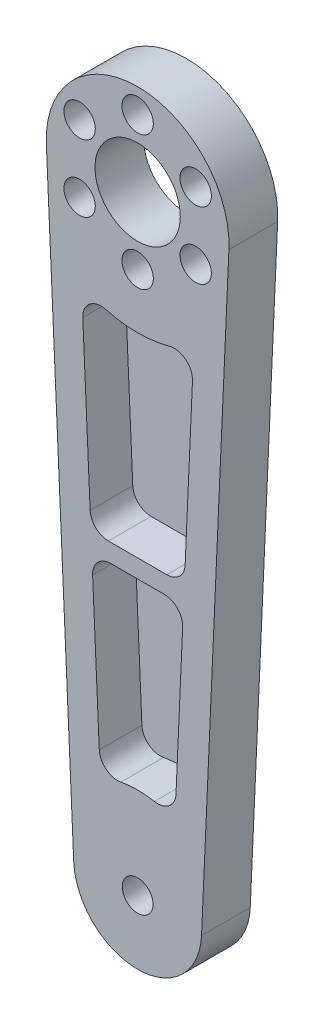
ISO-10303-21;
HEADER;
FILE_DESCRIPTION(('STEP AP214'),'2;1');
FILE_NAME('part.step','',(''),(''),'','','');
FILE_SCHEMA(('AUTOMOTIVE_DESIGN { 1 0 10303 214 1 1 1 1 }'));
ENDSEC;
DATA;
#1=APPLICATION_CONTEXT('core data for automotive mechanical design processes');
#2=APPLICATION_PROTOCOL_DEFINITION('international standard','automotive_design',2000,#1);
#3=PRODUCT_CONTEXT('',#1,'mechanical');
#4=PRODUCT('Part','Part','',(#3));
#5=PRODUCT_RELATED_PRODUCT_CATEGORY('part','',(#4));
#6=PRODUCT_DEFINITION_FORMATION('','',#4);
#7=PRODUCT_DEFINITION_CONTEXT('part definition',#1,'design');
#8=PRODUCT_DEFINITION('design','',#6,#7);
#9=PRODUCT_DEFINITION_SHAPE('','',#8);
#10=(LENGTH_UNIT() NAMED_UNIT(*) SI_UNIT(.MILLI.,.METRE.));
#11=(NAMED_UNIT(*) PLANE_ANGLE_UNIT() SI_UNIT($,.RADIAN.));
#12=(NAMED_UNIT(*) SI_UNIT($,.STERADIAN.) SOLID_ANGLE_UNIT());
#13=UNCERTAINTY_MEASURE_WITH_UNIT(LENGTH_MEASURE(1.E-05),#10,'distance_accuracy_value','');
#14=(GEOMETRIC_REPRESENTATION_CONTEXT(3) GLOBAL_UNCERTAINTY_ASSIGNED_CONTEXT((#13)) GLOBAL_UNIT_ASSIGNED_CONTEXT((#10,
#11,#12)) REPRESENTATION_CONTEXT('',''));
#15=CARTESIAN_POINT('',(0.,0.,0.));
#16=DIRECTION('',(0.,0.,1.));
#17=DIRECTION('',(1.,0.,0.));
#18=AXIS2_PLACEMENT_3D('',#15,#16,#17);
#19=CARTESIAN_POINT('',(0.,0.,8.));
#20=DIRECTION('',(0.,0.,1.));
#21=DIRECTION('',(1.,0.,0.));
#22=AXIS2_PLACEMENT_3D('',#19,#20,#21);
#23=PLANE('',#22);
#24=CARTESIAN_POINT('',(4.7998623234011,-49.,8.));
#25=DIRECTION('',(0.,0.,1.));
#26=DIRECTION('',(1.,0.,0.));
#27=AXIS2_PLACEMENT_3D('',#24,#25,#26);
#28=CIRCLE('',#27,3.);
#29=CARTESIAN_POINT('',(4.7998623234011,-52.,8.));
#30=VERTEX_POINT('',#29);
#31=CARTESIAN_POINT('',(7.79682328410779,-49.135,8.));
#32=VERTEX_POINT('',#31);
#33=EDGE_CURVE('E60',#30,#32,#28,.T.);
#34=ORIENTED_EDGE('',*,*,#33,.F.);
#35=DIRECTION('',(-1.,0.,0.));
#36=VECTOR('',#35,1.);
#37=CARTESIAN_POINT('',(0.,-52.,8.));
#38=LINE('',#37,#36);
#39=CARTESIAN_POINT('',(-4.79986232340109,-52.,8.));
#40=VERTEX_POINT('',#39);
#41=EDGE_CURVE('E203',#30,#40,#38,.T.);
#42=ORIENTED_EDGE('',*,*,#41,.T.);
#43=CARTESIAN_POINT('',(-4.79986232340108,-49.,8.));
#44=DIRECTION('',(0.,0.,1.));
#45=DIRECTION('',(1.,0.,0.));
#46=AXIS2_PLACEMENT_3D('',#43,#44,#45);
#47=CIRCLE('',#46,3.);
#48=CARTESIAN_POINT('',(-7.79682328410778,-49.135,8.));
#49=VERTEX_POINT('',#48);
#50=EDGE_CURVE('E206',#49,#40,#47,.T.);
#51=ORIENTED_EDGE('',*,*,#50,.F.);
#52=DIRECTION('',(-0.0449999999999999,0.998986986902232,0.));
#53=VECTOR('',#52,1.);
#54=CARTESIAN_POINT('',(-9.98986986902231,-0.449999999999999,8.));
#55=LINE('',#54,#53);
#56=CARTESIAN_POINT('',(-9.00396926551301,-22.3367082952188,8.));
#57=VERTEX_POINT('',#56);
#58=EDGE_CURVE('E232',#49,#57,#55,.T.);
#59=ORIENTED_EDGE('',*,*,#58,.T.);
#60=CARTESIAN_POINT('',(-6.00700830480632,-22.2017082952188,8.));
#61=DIRECTION('',(0.,0.,1.));
#62=DIRECTION('',(1.,0.,0.));
#63=AXIS2_PLACEMENT_3D('',#60,#61,#62);
#64=CIRCLE('',#63,3.);
#65=CARTESIAN_POINT('',(-5.22348548244029,-19.3058333001903,8.));
#66=VERTEX_POINT('',#65);
#67=EDGE_CURVE('E229',#66,#57,#64,.T.);
#68=ORIENTED_EDGE('',*,*,#67,.F.);
#69=CARTESIAN_POINT('',(0.,0.,8.));
#70=DIRECTION('',(0.,0.,1.));
#71=DIRECTION('',(1.,0.,0.));
#72=AXIS2_PLACEMENT_3D('',#69,#70,#71);
#73=CIRCLE('',#72,20.);
#74=CARTESIAN_POINT('',(5.22348548244028,-19.3058333001903,8.));
#75=VERTEX_POINT('',#74);
#76=EDGE_CURVE('E226',#66,#75,#73,.T.);
#77=ORIENTED_EDGE('',*,*,#76,.T.);
#78=CARTESIAN_POINT('',(6.00700830480632,-22.2017082952188,8.));
#79=DIRECTION('',(0.,0.,1.));
#80=DIRECTION('',(1.,0.,0.));
#81=AXIS2_PLACEMENT_3D('',#78,#79,#80);
#82=CIRCLE('',#81,3.);
#83=CARTESIAN_POINT('',(9.00396926551302,-22.3367082952188,8.));
#84=VERTEX_POINT('',#83);
#85=EDGE_CURVE('E223',#84,#75,#82,.T.);
#86=ORIENTED_EDGE('',*,*,#85,.F.);
#87=DIRECTION('',(-0.0449999999999997,-0.998986986902232,0.));
#88=VECTOR('',#87,1.);
#89=CARTESIAN_POINT('',(9.98986986902231,-0.449999999999997,8.));
#90=LINE('',#89,#88);
#91=EDGE_CURVE('E221',#84,#32,#90,.T.);
#92=ORIENTED_EDGE('',*,*,#91,.T.);
#93=EDGE_LOOP('',(#34,#42,#51,#59,#68,#77,#86,#92));
#94=FACE_BOUND('',#93,.T.);
#95=CARTESIAN_POINT('',(-4.39445163706585,-58.,8.));
#96=DIRECTION('',(0.,0.,1.));
#97=DIRECTION('',(1.,0.,0.));
#98=AXIS2_PLACEMENT_3D('',#95,#96,#97);
#99=CIRCLE('',#98,3.);
#100=CARTESIAN_POINT('',(-4.39445163706585,-55.,8.));
#101=VERTEX_POINT('',#100);
#102=CARTESIAN_POINT('',(-7.39141259777255,-58.135,8.));
#103=VERTEX_POINT('',#102);
#104=EDGE_CURVE('E68',#101,#103,#99,.T.);
#105=ORIENTED_EDGE('',*,*,#104,.F.);
#106=DIRECTION('',(1.,0.,0.));
#107=VECTOR('',#106,1.);
#108=CARTESIAN_POINT('',(0.,-55.,8.));
#109=LINE('',#108,#107);
#110=CARTESIAN_POINT('',(4.39445163706587,-55.,8.));
#111=VERTEX_POINT('',#110);
#112=EDGE_CURVE('E268',#101,#111,#109,.T.);
#113=ORIENTED_EDGE('',*,*,#112,.T.);
#114=CARTESIAN_POINT('',(4.39445163706587,-58.,8.));
#115=DIRECTION('',(0.,0.,1.));
#116=DIRECTION('',(1.,0.,0.));
#117=AXIS2_PLACEMENT_3D('',#114,#115,#116);
#118=CIRCLE('',#117,3.);
#119=CARTESIAN_POINT('',(7.39141259777256,-58.135,8.));
#120=VERTEX_POINT('',#119);
#121=EDGE_CURVE('E271',#120,#111,#118,.T.);
#122=ORIENTED_EDGE('',*,*,#121,.F.);
#123=DIRECTION('',(-0.0449999999999997,-0.998986986902232,0.));
#124=VECTOR('',#123,1.);
#125=CARTESIAN_POINT('',(9.98986986902231,-0.449999999999997,8.));
#126=LINE('',#125,#124);
#127=CARTESIAN_POINT('',(6.2965778841112,-82.4400140390341,8.));
#128=VERTEX_POINT('',#127);
#129=EDGE_CURVE('E275',#120,#128,#126,.T.);
#130=ORIENTED_EDGE('',*,*,#129,.T.);
#131=CARTESIAN_POINT('',(3.29961692340451,-82.305014039034,8.));
#132=DIRECTION('',(0.,0.,1.));
#133=DIRECTION('',(1.,0.,0.));
#134=AXIS2_PLACEMENT_3D('',#131,#132,#133);
#135=CIRCLE('',#134,3.);
#136=CARTESIAN_POINT('',(2.74968076950375,-85.2541783658617,8.));
#137=VERTEX_POINT('',#136);
#138=EDGE_CURVE('E278',#137,#128,#135,.T.);
#139=ORIENTED_EDGE('',*,*,#138,.F.);
#140=CARTESIAN_POINT('',(0.,-100.,8.));
#141=DIRECTION('',(0.,0.,1.));
#142=DIRECTION('',(1.,0.,0.));
#143=AXIS2_PLACEMENT_3D('',#140,#141,#142);
#144=CIRCLE('',#143,15.);
#145=CARTESIAN_POINT('',(-2.74968076950374,-85.2541783658617,8.));
#146=VERTEX_POINT('',#145);
#147=EDGE_CURVE('E281',#137,#146,#144,.T.);
#148=ORIENTED_EDGE('',*,*,#147,.T.);
#149=CARTESIAN_POINT('',(-3.29961692340449,-82.305014039034,8.));
#150=DIRECTION('',(0.,0.,1.));
#151=DIRECTION('',(1.,0.,0.));
#152=AXIS2_PLACEMENT_3D('',#149,#150,#151);
#153=CIRCLE('',#152,3.);
#154=CARTESIAN_POINT('',(-6.29657788411119,-82.440014039034,8.));
#155=VERTEX_POINT('',#154);
#156=EDGE_CURVE('E284',#155,#146,#153,.T.);
#157=ORIENTED_EDGE('',*,*,#156,.F.);
#158=DIRECTION('',(-0.045,0.998986986902232,0.));
#159=VECTOR('',#158,1.);
#160=CARTESIAN_POINT('',(-9.98986986902232,-0.45,8.));
#161=LINE('',#160,#159);
#162=EDGE_CURVE('E287',#155,#103,#161,.T.);
#163=ORIENTED_EDGE('',*,*,#162,.T.);
#164=EDGE_LOOP('',(#105,#113,#122,#130,#139,#148,#157,#163));
#165=FACE_BOUND('',#164,.T.);
#166=CARTESIAN_POINT('',(0.,0.,8.));
#167=DIRECTION('',(0.,0.,1.));
#168=DIRECTION('',(1.,0.,0.));
#169=AXIS2_PLACEMENT_3D('',#166,#167,#168);
#170=CIRCLE('',#169,7.);
#171=CARTESIAN_POINT('',(7.,0.,8.));
#172=VERTEX_POINT('',#171);
#173=EDGE_CURVE('E315',#172,#172,#170,.T.);
#174=ORIENTED_EDGE('',*,*,#173,.F.);
#175=EDGE_LOOP('',(#174));
#176=FACE_BOUND('',#175,.T.);
#177=CARTESIAN_POINT('',(-9.52627944162882,-5.5,8.));
#178=DIRECTION('',(0.,0.,1.));
#179=DIRECTION('',(1.,0.,0.));
#180=AXIS2_PLACEMENT_3D('',#177,#178,#179);
#181=CIRCLE('',#180,2.575);
#182=CARTESIAN_POINT('',(-6.95127944162882,-5.5,8.));
#183=VERTEX_POINT('',#182);
#184=EDGE_CURVE('E327',#183,#183,#181,.T.);
#185=ORIENTED_EDGE('',*,*,#184,.F.);
#186=EDGE_LOOP('',(#185));
#187=FACE_BOUND('',#186,.T.);
#188=CARTESIAN_POINT('',(9.52627944162882,-5.5,8.));
#189=DIRECTION('',(0.,0.,1.));
#190=DIRECTION('',(1.,0.,0.));
#191=AXIS2_PLACEMENT_3D('',#188,#189,#190);
#192=CIRCLE('',#191,2.575);
#193=CARTESIAN_POINT('',(12.1012794416288,-5.5,8.));
#194=VERTEX_POINT('',#193);
#195=EDGE_CURVE('E339',#194,#194,#192,.T.);
#196=ORIENTED_EDGE('',*,*,#195,.F.);
#197=EDGE_LOOP('',(#196));
#198=FACE_BOUND('',#197,.T.);
#199=CARTESIAN_POINT('',(0.,11.,8.));
#200=DIRECTION('',(0.,0.,1.));
#201=DIRECTION('',(1.,0.,0.));
#202=AXIS2_PLACEMENT_3D('',#199,#200,#201);
#203=CIRCLE('',#202,2.575);
#204=CARTESIAN_POINT('',(2.575,11.,8.));
#205=VERTEX_POINT('',#204);
#206=EDGE_CURVE('E351',#205,#205,#203,.T.);
#207=ORIENTED_EDGE('',*,*,#206,.F.);
#208=EDGE_LOOP('',(#207));
#209=FACE_BOUND('',#208,.T.);
#210=CARTESIAN_POINT('',(0.,0.,8.));
#211=DIRECTION('',(0.,0.,1.));
#212=DIRECTION('',(1.,0.,0.));
#213=AXIS2_PLACEMENT_3D('',#210,#211,#212);
#214=CIRCLE('',#213,15.);
#215=CARTESIAN_POINT('',(14.9848048035335,-0.674999999999999,8.));
#216=VERTEX_POINT('',#215);
#217=CARTESIAN_POINT('',(-14.9848048035335,-0.674999999999999,8.));
#218=VERTEX_POINT('',#217);
#219=EDGE_CURVE('E357',#216,#218,#214,.T.);
#220=ORIENTED_EDGE('',*,*,#219,.T.);
#221=DIRECTION('',(0.045,-0.998986986902232,0.));
#222=VECTOR('',#221,1.);
#223=CARTESIAN_POINT('',(-14.9848048035335,-0.674999999999999,8.));
#224=LINE('',#223,#222);
#225=CARTESIAN_POINT('',(-10.4893633624734,-100.4725,8.));
#226=VERTEX_POINT('',#225);
#227=EDGE_CURVE('E360',#218,#226,#224,.T.);
#228=ORIENTED_EDGE('',*,*,#227,.T.);
#229=CARTESIAN_POINT('',(0.,-100.,8.));
#230=DIRECTION('',(0.,0.,1.));
#231=DIRECTION('',(1.,0.,0.));
#232=AXIS2_PLACEMENT_3D('',#229,#230,#231);
#233=CIRCLE('',#232,10.5);
#234=CARTESIAN_POINT('',(10.4893633624734,-100.4725,8.));
#235=VERTEX_POINT('',#234);
#236=EDGE_CURVE('E363',#226,#235,#233,.T.);
#237=ORIENTED_EDGE('',*,*,#236,.T.);
#238=DIRECTION('',(0.045,0.998986986902232,0.));
#239=VECTOR('',#238,1.);
#240=CARTESIAN_POINT('',(14.9848048035335,-0.674999999999999,8.));
#241=LINE('',#240,#239);
#242=EDGE_CURVE('E365',#235,#216,#241,.T.);
#243=ORIENTED_EDGE('',*,*,#242,.T.);
#244=EDGE_LOOP('',(#220,#228,#237,#243));
#245=FACE_BOUND('',#244,.T.);
#246=CARTESIAN_POINT('',(9.52627944162882,5.50000000000001,8.));
#247=DIRECTION('',(0.,0.,1.));
#248=DIRECTION('',(1.,0.,0.));
#249=AXIS2_PLACEMENT_3D('',#246,#247,#248);
#250=CIRCLE('',#249,2.575);
#251=CARTESIAN_POINT('',(12.1012794416288,5.50000000000001,8.));
#252=VERTEX_POINT('',#251);
#253=EDGE_CURVE('E345',#252,#252,#250,.T.);
#254=ORIENTED_EDGE('',*,*,#253,.F.);
#255=EDGE_LOOP('',(#254));
#256=FACE_BOUND('',#255,.T.);
#257=CARTESIAN_POINT('',(0.,-11.,8.));
#258=DIRECTION('',(0.,0.,1.));
#259=DIRECTION('',(1.,0.,0.));
#260=AXIS2_PLACEMENT_3D('',#257,#258,#259);
#261=CIRCLE('',#260,2.575);
#262=CARTESIAN_POINT('',(2.575,-11.,8.));
#263=VERTEX_POINT('',#262);
#264=EDGE_CURVE('E333',#263,#263,#261,.T.);
#265=ORIENTED_EDGE('',*,*,#264,.F.);
#266=EDGE_LOOP('',(#265));
#267=FACE_BOUND('',#266,.T.);
#268=CARTESIAN_POINT('',(-9.52627944162883,5.49999999999999,8.));
#269=DIRECTION('',(0.,0.,1.));
#270=DIRECTION('',(1.,0.,0.));
#271=AXIS2_PLACEMENT_3D('',#268,#269,#270);
#272=CIRCLE('',#271,2.575);
#273=CARTESIAN_POINT('',(-6.95127944162883,5.49999999999999,8.));
#274=VERTEX_POINT('',#273);
#275=EDGE_CURVE('E321',#274,#274,#272,.T.);
#276=ORIENTED_EDGE('',*,*,#275,.F.);
#277=EDGE_LOOP('',(#276));
#278=FACE_BOUND('',#277,.T.);
#279=CARTESIAN_POINT('',(0.,-100.,8.));
#280=DIRECTION('',(0.,0.,1.));
#281=DIRECTION('',(1.,0.,0.));
#282=AXIS2_PLACEMENT_3D('',#279,#280,#281);
#283=CIRCLE('',#282,2.525);
#284=CARTESIAN_POINT('',(2.525,-100.,8.));
#285=VERTEX_POINT('',#284);
#286=EDGE_CURVE('E309',#285,#285,#283,.T.);
#287=ORIENTED_EDGE('',*,*,#286,.F.);
#288=EDGE_LOOP('',(#287));
#289=FACE_BOUND('',#288,.T.);
#290=ADVANCED_FACE('F45',(#94,#165,#176,#187,#198,#209,#245,#256,#267,#278,#289),#23,.T.);
#291=CARTESIAN_POINT('',(0.,0.,0.));
#292=DIRECTION('',(0.,0.,1.));
#293=DIRECTION('',(1.,0.,0.));
#294=AXIS2_PLACEMENT_3D('',#291,#292,#293);
#295=PLANE('',#294);
#296=CARTESIAN_POINT('',(0.,0.,0.));
#297=DIRECTION('',(0.,0.,1.));
#298=DIRECTION('',(1.,0.,0.));
#299=AXIS2_PLACEMENT_3D('',#296,#297,#298);
#300=CIRCLE('',#299,15.);
#301=CARTESIAN_POINT('',(14.9848048035335,-0.674999999999999,0.));
#302=VERTEX_POINT('',#301);
#303=CARTESIAN_POINT('',(-14.9848048035335,-0.674999999999999,0.));
#304=VERTEX_POINT('',#303);
#305=EDGE_CURVE('E354',#302,#304,#300,.T.);
#306=ORIENTED_EDGE('',*,*,#305,.F.);
#307=DIRECTION('',(0.045,0.998986986902232,0.));
#308=VECTOR('',#307,1.);
#309=CARTESIAN_POINT('',(14.9848048035335,-0.674999999999999,0.));
#310=LINE('',#309,#308);
#311=CARTESIAN_POINT('',(10.4893633624734,-100.4725,0.));
#312=VERTEX_POINT('',#311);
#313=EDGE_CURVE('E361',#312,#302,#310,.T.);
#314=ORIENTED_EDGE('',*,*,#313,.F.);
#315=CARTESIAN_POINT('',(0.,-100.,0.));
#316=DIRECTION('',(0.,0.,1.));
#317=DIRECTION('',(1.,0.,0.));
#318=AXIS2_PLACEMENT_3D('',#315,#316,#317);
#319=CIRCLE('',#318,10.5);
#320=CARTESIAN_POINT('',(-10.4893633624734,-100.4725,0.));
#321=VERTEX_POINT('',#320);
#322=EDGE_CURVE('E372',#321,#312,#319,.T.);
#323=ORIENTED_EDGE('',*,*,#322,.F.);
#324=DIRECTION('',(0.045,-0.998986986902232,0.));
#325=VECTOR('',#324,1.);
#326=CARTESIAN_POINT('',(-14.9848048035335,-0.674999999999999,0.));
#327=LINE('',#326,#325);
#328=EDGE_CURVE('E370',#304,#321,#327,.T.);
#329=ORIENTED_EDGE('',*,*,#328,.F.);
#330=EDGE_LOOP('',(#306,#314,#323,#329));
#331=FACE_BOUND('',#330,.T.);
#332=CARTESIAN_POINT('',(0.,11.,0.));
#333=DIRECTION('',(0.,0.,1.));
#334=DIRECTION('',(1.,0.,0.));
#335=AXIS2_PLACEMENT_3D('',#332,#333,#334);
#336=CIRCLE('',#335,2.575);
#337=CARTESIAN_POINT('',(2.575,11.,0.));
#338=VERTEX_POINT('',#337);
#339=EDGE_CURVE('E348',#338,#338,#336,.T.);
#340=ORIENTED_EDGE('',*,*,#339,.T.);
#341=EDGE_LOOP('',(#340));
#342=FACE_BOUND('',#341,.T.);
#343=CARTESIAN_POINT('',(9.52627944162882,5.50000000000001,0.));
#344=DIRECTION('',(0.,0.,1.));
#345=DIRECTION('',(1.,0.,0.));
#346=AXIS2_PLACEMENT_3D('',#343,#344,#345);
#347=CIRCLE('',#346,2.575);
#348=CARTESIAN_POINT('',(12.1012794416288,5.50000000000001,0.));
#349=VERTEX_POINT('',#348);
#350=EDGE_CURVE('E342',#349,#349,#347,.T.);
#351=ORIENTED_EDGE('',*,*,#350,.T.);
#352=EDGE_LOOP('',(#351));
#353=FACE_BOUND('',#352,.T.);
#354=CARTESIAN_POINT('',(9.52627944162882,-5.5,0.));
#355=DIRECTION('',(0.,0.,1.));
#356=DIRECTION('',(1.,0.,0.));
#357=AXIS2_PLACEMENT_3D('',#354,#355,#356);
#358=CIRCLE('',#357,2.575);
#359=CARTESIAN_POINT('',(12.1012794416288,-5.5,0.));
#360=VERTEX_POINT('',#359);
#361=EDGE_CURVE('E336',#360,#360,#358,.T.);
#362=ORIENTED_EDGE('',*,*,#361,.T.);
#363=EDGE_LOOP('',(#362));
#364=FACE_BOUND('',#363,.T.);
#365=CARTESIAN_POINT('',(0.,-11.,0.));
#366=DIRECTION('',(0.,0.,1.));
#367=DIRECTION('',(1.,0.,0.));
#368=AXIS2_PLACEMENT_3D('',#365,#366,#367);
#369=CIRCLE('',#368,2.575);
#370=CARTESIAN_POINT('',(2.575,-11.,0.));
#371=VERTEX_POINT('',#370);
#372=EDGE_CURVE('E330',#371,#371,#369,.T.);
#373=ORIENTED_EDGE('',*,*,#372,.T.);
#374=EDGE_LOOP('',(#373));
#375=FACE_BOUND('',#374,.T.);
#376=CARTESIAN_POINT('',(-9.52627944162882,-5.5,0.));
#377=DIRECTION('',(0.,0.,1.));
#378=DIRECTION('',(1.,0.,0.));
#379=AXIS2_PLACEMENT_3D('',#376,#377,#378);
#380=CIRCLE('',#379,2.575);
#381=CARTESIAN_POINT('',(-6.95127944162882,-5.5,0.));
#382=VERTEX_POINT('',#381);
#383=EDGE_CURVE('E324',#382,#382,#380,.T.);
#384=ORIENTED_EDGE('',*,*,#383,.T.);
#385=EDGE_LOOP('',(#384));
#386=FACE_BOUND('',#385,.T.);
#387=CARTESIAN_POINT('',(-9.52627944162883,5.49999999999999,0.));
#388=DIRECTION('',(0.,0.,1.));
#389=DIRECTION('',(1.,0.,0.));
#390=AXIS2_PLACEMENT_3D('',#387,#388,#389);
#391=CIRCLE('',#390,2.575);
#392=CARTESIAN_POINT('',(-6.95127944162883,5.49999999999999,0.));
#393=VERTEX_POINT('',#392);
#394=EDGE_CURVE('E318',#393,#393,#391,.T.);
#395=ORIENTED_EDGE('',*,*,#394,.T.);
#396=EDGE_LOOP('',(#395));
#397=FACE_BOUND('',#396,.T.);
#398=CARTESIAN_POINT('',(0.,0.,0.));
#399=DIRECTION('',(0.,0.,1.));
#400=DIRECTION('',(1.,0.,0.));
#401=AXIS2_PLACEMENT_3D('',#398,#399,#400);
#402=CIRCLE('',#401,7.);
#403=CARTESIAN_POINT('',(7.,0.,0.));
#404=VERTEX_POINT('',#403);
#405=EDGE_CURVE('E312',#404,#404,#402,.T.);
#406=ORIENTED_EDGE('',*,*,#405,.T.);
#407=EDGE_LOOP('',(#406));
#408=FACE_BOUND('',#407,.T.);
#409=CARTESIAN_POINT('',(0.,-100.,0.));
#410=DIRECTION('',(0.,0.,1.));
#411=DIRECTION('',(1.,0.,0.));
#412=AXIS2_PLACEMENT_3D('',#409,#410,#411);
#413=CIRCLE('',#412,2.525);
#414=CARTESIAN_POINT('',(2.525,-100.,0.));
#415=VERTEX_POINT('',#414);
#416=EDGE_CURVE('E239',#415,#415,#413,.T.);
#417=ORIENTED_EDGE('',*,*,#416,.T.);
#418=EDGE_LOOP('',(#417));
#419=FACE_BOUND('',#418,.T.);
#420=ADVANCED_FACE('F390',(#331,#342,#353,#364,#375,#386,#397,#408,#419),#295,.F.);
#421=CARTESIAN_POINT('',(0.,0.,8.));
#422=DIRECTION('',(0.,0.,-1.));
#423=DIRECTION('',(-1.,0.,0.));
#424=AXIS2_PLACEMENT_3D('',#421,#422,#423);
#425=CYLINDRICAL_SURFACE('',#424,15.);
#426=ORIENTED_EDGE('',*,*,#305,.T.);
#427=DIRECTION('',(0.,0.,-1.));
#428=VECTOR('',#427,1.);
#429=CARTESIAN_POINT('',(-14.9848048035335,-0.674999999999999,8.));
#430=LINE('',#429,#428);
#431=EDGE_CURVE('E11',#218,#304,#430,.T.);
#432=ORIENTED_EDGE('',*,*,#431,.F.);
#433=ORIENTED_EDGE('',*,*,#219,.F.);
#434=DIRECTION('',(0.,0.,-1.));
#435=VECTOR('',#434,1.);
#436=CARTESIAN_POINT('',(14.9848048035335,-0.674999999999999,8.));
#437=LINE('',#436,#435);
#438=EDGE_CURVE('E367',#216,#302,#437,.T.);
#439=ORIENTED_EDGE('',*,*,#438,.T.);
#440=EDGE_LOOP('',(#426,#432,#433,#439));
#441=FACE_BOUND('',#440,.T.);
#442=ADVANCED_FACE('F47',(#441),#425,.T.);
#443=CARTESIAN_POINT('',(-14.9848048035335,-0.674999999999999,8.));
#444=DIRECTION('',(0.998986986902232,0.045,0.));
#445=DIRECTION('',(-0.045,0.998986986902232,0.));
#446=AXIS2_PLACEMENT_3D('',#443,#444,#445);
#447=PLANE('',#446);
#448=ORIENTED_EDGE('',*,*,#328,.T.);
#449=DIRECTION('',(0.,0.,-1.));
#450=VECTOR('',#449,1.);
#451=CARTESIAN_POINT('',(-10.4893633624734,-100.4725,8.));
#452=LINE('',#451,#450);
#453=EDGE_CURVE('E53',#226,#321,#452,.T.);
#454=ORIENTED_EDGE('',*,*,#453,.F.);
#455=ORIENTED_EDGE('',*,*,#227,.F.);
#456=ORIENTED_EDGE('',*,*,#431,.T.);
#457=EDGE_LOOP('',(#448,#454,#455,#456));
#458=FACE_BOUND('',#457,.T.);
#459=ADVANCED_FACE('F401',(#458),#447,.F.);
#460=CARTESIAN_POINT('',(0.,-100.,8.));
#461=DIRECTION('',(0.,0.,-1.));
#462=DIRECTION('',(-1.,0.,0.));
#463=AXIS2_PLACEMENT_3D('',#460,#461,#462);
#464=CYLINDRICAL_SURFACE('',#463,10.5);
#465=ORIENTED_EDGE('',*,*,#322,.T.);
#466=DIRECTION('',(0.,0.,-1.));
#467=VECTOR('',#466,1.);
#468=CARTESIAN_POINT('',(10.4893633624734,-100.4725,8.));
#469=LINE('',#468,#467);
#470=EDGE_CURVE('E377',#235,#312,#469,.T.);
#471=ORIENTED_EDGE('',*,*,#470,.F.);
#472=ORIENTED_EDGE('',*,*,#236,.F.);
#473=ORIENTED_EDGE('',*,*,#453,.T.);
#474=EDGE_LOOP('',(#465,#471,#472,#473));
#475=FACE_BOUND('',#474,.T.);
#476=ADVANCED_FACE('F384',(#475),#464,.T.);
#477=CARTESIAN_POINT('',(14.9848048035335,-0.674999999999999,8.));
#478=DIRECTION('',(-0.998986986902232,0.045,0.));
#479=DIRECTION('',(-0.045,-0.998986986902232,0.));
#480=AXIS2_PLACEMENT_3D('',#477,#478,#479);
#481=PLANE('',#480);
#482=ORIENTED_EDGE('',*,*,#313,.T.);
#483=ORIENTED_EDGE('',*,*,#438,.F.);
#484=ORIENTED_EDGE('',*,*,#242,.F.);
#485=ORIENTED_EDGE('',*,*,#470,.T.);
#486=EDGE_LOOP('',(#482,#483,#484,#485));
#487=FACE_BOUND('',#486,.T.);
#488=ADVANCED_FACE('F394',(#487),#481,.F.);
#489=CARTESIAN_POINT('',(0.,11.,8.));
#490=DIRECTION('',(0.,0.,-1.));
#491=DIRECTION('',(-1.,0.,0.));
#492=AXIS2_PLACEMENT_3D('',#489,#490,#491);
#493=CYLINDRICAL_SURFACE('',#492,2.575);
#494=ORIENTED_EDGE('',*,*,#206,.T.);
#495=EDGE_LOOP('',(#494));
#496=FACE_BOUND('',#495,.T.);
#497=ORIENTED_EDGE('',*,*,#339,.F.);
#498=EDGE_LOOP('',(#497));
#499=FACE_BOUND('',#498,.T.);
#500=ADVANCED_FACE('F419',(#496,#499),#493,.F.);
#501=CARTESIAN_POINT('',(9.52627944162882,5.50000000000001,8.));
#502=DIRECTION('',(0.,0.,-1.));
#503=DIRECTION('',(-1.,0.,0.));
#504=AXIS2_PLACEMENT_3D('',#501,#502,#503);
#505=CYLINDRICAL_SURFACE('',#504,2.575);
#506=ORIENTED_EDGE('',*,*,#253,.T.);
#507=EDGE_LOOP('',(#506));
#508=FACE_BOUND('',#507,.T.);
#509=ORIENTED_EDGE('',*,*,#350,.F.);
#510=EDGE_LOOP('',(#509));
#511=FACE_BOUND('',#510,.T.);
#512=ADVANCED_FACE('F426',(#508,#511),#505,.F.);
#513=CARTESIAN_POINT('',(9.52627944162882,-5.5,8.));
#514=DIRECTION('',(0.,0.,-1.));
#515=DIRECTION('',(-1.,0.,0.));
#516=AXIS2_PLACEMENT_3D('',#513,#514,#515);
#517=CYLINDRICAL_SURFACE('',#516,2.575);
#518=ORIENTED_EDGE('',*,*,#195,.T.);
#519=EDGE_LOOP('',(#518));
#520=FACE_BOUND('',#519,.T.);
#521=ORIENTED_EDGE('',*,*,#361,.F.);
#522=EDGE_LOOP('',(#521));
#523=FACE_BOUND('',#522,.T.);
#524=ADVANCED_FACE('F431',(#520,#523),#517,.F.);
#525=CARTESIAN_POINT('',(0.,-11.,8.));
#526=DIRECTION('',(0.,0.,-1.));
#527=DIRECTION('',(-1.,0.,0.));
#528=AXIS2_PLACEMENT_3D('',#525,#526,#527);
#529=CYLINDRICAL_SURFACE('',#528,2.575);
#530=ORIENTED_EDGE('',*,*,#264,.T.);
#531=EDGE_LOOP('',(#530));
#532=FACE_BOUND('',#531,.T.);
#533=ORIENTED_EDGE('',*,*,#372,.F.);
#534=EDGE_LOOP('',(#533));
#535=FACE_BOUND('',#534,.T.);
#536=ADVANCED_FACE('F474',(#532,#535),#529,.F.);
#537=CARTESIAN_POINT('',(-9.52627944162882,-5.5,8.));
#538=DIRECTION('',(0.,0.,-1.));
#539=DIRECTION('',(-1.,0.,0.));
#540=AXIS2_PLACEMENT_3D('',#537,#538,#539);
#541=CYLINDRICAL_SURFACE('',#540,2.575);
#542=ORIENTED_EDGE('',*,*,#184,.T.);
#543=EDGE_LOOP('',(#542));
#544=FACE_BOUND('',#543,.T.);
#545=ORIENTED_EDGE('',*,*,#383,.F.);
#546=EDGE_LOOP('',(#545));
#547=FACE_BOUND('',#546,.T.);
#548=ADVANCED_FACE('F470',(#544,#547),#541,.F.);
#549=CARTESIAN_POINT('',(-9.52627944162883,5.49999999999999,8.));
#550=DIRECTION('',(0.,0.,-1.));
#551=DIRECTION('',(-1.,0.,0.));
#552=AXIS2_PLACEMENT_3D('',#549,#550,#551);
#553=CYLINDRICAL_SURFACE('',#552,2.575);
#554=ORIENTED_EDGE('',*,*,#275,.T.);
#555=EDGE_LOOP('',(#554));
#556=FACE_BOUND('',#555,.T.);
#557=ORIENTED_EDGE('',*,*,#394,.F.);
#558=EDGE_LOOP('',(#557));
#559=FACE_BOUND('',#558,.T.);
#560=ADVANCED_FACE('F461',(#556,#559),#553,.F.);
#561=CARTESIAN_POINT('',(0.,0.,8.));
#562=DIRECTION('',(0.,0.,-1.));
#563=DIRECTION('',(-1.,0.,0.));
#564=AXIS2_PLACEMENT_3D('',#561,#562,#563);
#565=CYLINDRICAL_SURFACE('',#564,7.);
#566=ORIENTED_EDGE('',*,*,#173,.T.);
#567=EDGE_LOOP('',(#566));
#568=FACE_BOUND('',#567,.T.);
#569=ORIENTED_EDGE('',*,*,#405,.F.);
#570=EDGE_LOOP('',(#569));
#571=FACE_BOUND('',#570,.T.);
#572=ADVANCED_FACE('F453',(#568,#571),#565,.F.);
#573=CARTESIAN_POINT('',(0.,-100.,8.));
#574=DIRECTION('',(0.,0.,-1.));
#575=DIRECTION('',(-1.,0.,0.));
#576=AXIS2_PLACEMENT_3D('',#573,#574,#575);
#577=CYLINDRICAL_SURFACE('',#576,2.525);
#578=ORIENTED_EDGE('',*,*,#286,.T.);
#579=EDGE_LOOP('',(#578));
#580=FACE_BOUND('',#579,.T.);
#581=ORIENTED_EDGE('',*,*,#416,.F.);
#582=EDGE_LOOP('',(#581));
#583=FACE_BOUND('',#582,.T.);
#584=ADVANCED_FACE('F451',(#580,#583),#577,.F.);
#585=CARTESIAN_POINT('',(-4.39445163706585,-58.,1.));
#586=DIRECTION('',(0.,0.,1.));
#587=DIRECTION('',(1.,0.,0.));
#588=AXIS2_PLACEMENT_3D('',#585,#586,#587);
#589=CYLINDRICAL_SURFACE('',#588,3.);
#590=ORIENTED_EDGE('',*,*,#104,.T.);
#591=DIRECTION('',(0.,0.,1.));
#592=VECTOR('',#591,1.);
#593=CARTESIAN_POINT('',(-7.39141259777255,-58.135,1.));
#594=LINE('',#593,#592);
#595=CARTESIAN_POINT('',(-7.39141259777255,-58.135,1.));
#596=VERTEX_POINT('',#595);
#597=EDGE_CURVE('E251',#596,#103,#594,.T.);
#598=ORIENTED_EDGE('',*,*,#597,.F.);
#599=CARTESIAN_POINT('',(-4.39445163706585,-58.,1.));
#600=DIRECTION('',(0.,0.,1.));
#601=DIRECTION('',(1.,0.,0.));
#602=AXIS2_PLACEMENT_3D('',#599,#600,#601);
#603=CIRCLE('',#602,3.);
#604=CARTESIAN_POINT('',(-4.39445163706585,-55.,1.));
#605=VERTEX_POINT('',#604);
#606=EDGE_CURVE('E272',#605,#596,#603,.T.);
#607=ORIENTED_EDGE('',*,*,#606,.F.);
#608=DIRECTION('',(0.,0.,1.));
#609=VECTOR('',#608,1.);
#610=CARTESIAN_POINT('',(-4.39445163706585,-55.,1.));
#611=LINE('',#610,#609);
#612=EDGE_CURVE('E266',#605,#101,#611,.T.);
#613=ORIENTED_EDGE('',*,*,#612,.T.);
#614=EDGE_LOOP('',(#590,#598,#607,#613));
#615=FACE_BOUND('',#614,.T.);
#616=ADVANCED_FACE('F452',(#615),#589,.F.);
#617=CARTESIAN_POINT('',(0.,-55.,1.));
#618=DIRECTION('',(0.,-1.,0.));
#619=DIRECTION('',(0.,0.,-1.));
#620=AXIS2_PLACEMENT_3D('',#617,#618,#619);
#621=PLANE('',#620);
#622=ORIENTED_EDGE('',*,*,#112,.F.);
#623=ORIENTED_EDGE('',*,*,#612,.F.);
#624=DIRECTION('',(1.,0.,0.));
#625=VECTOR('',#624,1.);
#626=CARTESIAN_POINT('',(0.,-55.,1.));
#627=LINE('',#626,#625);
#628=CARTESIAN_POINT('',(4.39445163706587,-55.,1.));
#629=VERTEX_POINT('',#628);
#630=EDGE_CURVE('E253',#605,#629,#627,.T.);
#631=ORIENTED_EDGE('',*,*,#630,.T.);
#632=DIRECTION('',(0.,0.,1.));
#633=VECTOR('',#632,1.);
#634=CARTESIAN_POINT('',(4.39445163706587,-55.,1.));
#635=LINE('',#634,#633);
#636=EDGE_CURVE('E264',#629,#111,#635,.T.);
#637=ORIENTED_EDGE('',*,*,#636,.T.);
#638=EDGE_LOOP('',(#622,#623,#631,#637));
#639=FACE_BOUND('',#638,.T.);
#640=ADVANCED_FACE('F459',(#639),#621,.T.);
#641=CARTESIAN_POINT('',(4.39445163706587,-58.,1.));
#642=DIRECTION('',(0.,0.,1.));
#643=DIRECTION('',(1.,0.,0.));
#644=AXIS2_PLACEMENT_3D('',#641,#642,#643);
#645=CYLINDRICAL_SURFACE('',#644,3.);
#646=ORIENTED_EDGE('',*,*,#121,.T.);
#647=ORIENTED_EDGE('',*,*,#636,.F.);
#648=CARTESIAN_POINT('',(4.39445163706587,-58.,1.));
#649=DIRECTION('',(0.,0.,1.));
#650=DIRECTION('',(1.,0.,0.));
#651=AXIS2_PLACEMENT_3D('',#648,#649,#650);
#652=CIRCLE('',#651,3.);
#653=CARTESIAN_POINT('',(7.39141259777256,-58.135,1.));
#654=VERTEX_POINT('',#653);
#655=EDGE_CURVE('E292',#654,#629,#652,.T.);
#656=ORIENTED_EDGE('',*,*,#655,.F.);
#657=DIRECTION('',(0.,0.,1.));
#658=VECTOR('',#657,1.);
#659=CARTESIAN_POINT('',(7.39141259777256,-58.135,1.));
#660=LINE('',#659,#658);
#661=EDGE_CURVE('E262',#654,#120,#660,.T.);
#662=ORIENTED_EDGE('',*,*,#661,.T.);
#663=EDGE_LOOP('',(#646,#647,#656,#662));
#664=FACE_BOUND('',#663,.T.);
#665=ADVANCED_FACE('F529',(#664),#645,.F.);
#666=CARTESIAN_POINT('',(9.98986986902231,-0.449999999999997,1.));
#667=DIRECTION('',(-0.998986986902232,0.0449999999999997,0.));
#668=DIRECTION('',(-0.0449999999999997,-0.998986986902232,0.));
#669=AXIS2_PLACEMENT_3D('',#666,#667,#668);
#670=PLANE('',#669);
#671=ORIENTED_EDGE('',*,*,#129,.F.);
#672=ORIENTED_EDGE('',*,*,#661,.F.);
#673=DIRECTION('',(-0.0449999999999997,-0.998986986902232,0.));
#674=VECTOR('',#673,1.);
#675=CARTESIAN_POINT('',(9.98986986902231,-0.449999999999997,1.));
#676=LINE('',#675,#674);
#677=CARTESIAN_POINT('',(6.2965778841112,-82.4400140390341,1.));
#678=VERTEX_POINT('',#677);
#679=EDGE_CURVE('E295',#654,#678,#676,.T.);
#680=ORIENTED_EDGE('',*,*,#679,.T.);
#681=DIRECTION('',(0.,0.,1.));
#682=VECTOR('',#681,1.);
#683=CARTESIAN_POINT('',(6.2965778841112,-82.4400140390341,1.));
#684=LINE('',#683,#682);
#685=EDGE_CURVE('E260',#678,#128,#684,.T.);
#686=ORIENTED_EDGE('',*,*,#685,.T.);
#687=EDGE_LOOP('',(#671,#672,#680,#686));
#688=FACE_BOUND('',#687,.T.);
#689=ADVANCED_FACE('F538',(#688),#670,.T.);
#690=CARTESIAN_POINT('',(3.29961692340451,-82.305014039034,1.));
#691=DIRECTION('',(0.,0.,1.));
#692=DIRECTION('',(1.,0.,0.));
#693=AXIS2_PLACEMENT_3D('',#690,#691,#692);
#694=CYLINDRICAL_SURFACE('',#693,3.);
#695=ORIENTED_EDGE('',*,*,#138,.T.);
#696=ORIENTED_EDGE('',*,*,#685,.F.);
#697=CARTESIAN_POINT('',(3.29961692340451,-82.305014039034,1.));
#698=DIRECTION('',(0.,0.,1.));
#699=DIRECTION('',(1.,0.,0.));
#700=AXIS2_PLACEMENT_3D('',#697,#698,#699);
#701=CIRCLE('',#700,3.);
#702=CARTESIAN_POINT('',(2.74968076950375,-85.2541783658617,1.));
#703=VERTEX_POINT('',#702);
#704=EDGE_CURVE('E297',#703,#678,#701,.T.);
#705=ORIENTED_EDGE('',*,*,#704,.F.);
#706=DIRECTION('',(0.,0.,1.));
#707=VECTOR('',#706,1.);
#708=CARTESIAN_POINT('',(2.74968076950375,-85.2541783658617,1.));
#709=LINE('',#708,#707);
#710=EDGE_CURVE('E258',#703,#137,#709,.T.);
#711=ORIENTED_EDGE('',*,*,#710,.T.);
#712=EDGE_LOOP('',(#695,#696,#705,#711));
#713=FACE_BOUND('',#712,.T.);
#714=ADVANCED_FACE('F548',(#713),#694,.F.);
#715=CARTESIAN_POINT('',(0.,-100.,1.));
#716=DIRECTION('',(0.,0.,1.));
#717=DIRECTION('',(1.,0.,0.));
#718=AXIS2_PLACEMENT_3D('',#715,#716,#717);
#719=CYLINDRICAL_SURFACE('',#718,15.);
#720=ORIENTED_EDGE('',*,*,#147,.F.);
#721=ORIENTED_EDGE('',*,*,#710,.F.);
#722=CARTESIAN_POINT('',(0.,-100.,1.));
#723=DIRECTION('',(0.,0.,1.));
#724=DIRECTION('',(1.,0.,0.));
#725=AXIS2_PLACEMENT_3D('',#722,#723,#724);
#726=CIRCLE('',#725,15.);
#727=CARTESIAN_POINT('',(-2.74968076950374,-85.2541783658617,1.));
#728=VERTEX_POINT('',#727);
#729=EDGE_CURVE('E300',#703,#728,#726,.T.);
#730=ORIENTED_EDGE('',*,*,#729,.T.);
#731=DIRECTION('',(0.,0.,1.));
#732=VECTOR('',#731,1.);
#733=CARTESIAN_POINT('',(-2.74968076950374,-85.2541783658617,1.));
#734=LINE('',#733,#732);
#735=EDGE_CURVE('E256',#728,#146,#734,.T.);
#736=ORIENTED_EDGE('',*,*,#735,.T.);
#737=EDGE_LOOP('',(#720,#721,#730,#736));
#738=FACE_BOUND('',#737,.T.);
#739=ADVANCED_FACE('F558',(#738),#719,.T.);
#740=CARTESIAN_POINT('',(-3.29961692340449,-82.305014039034,1.));
#741=DIRECTION('',(0.,0.,1.));
#742=DIRECTION('',(1.,0.,0.));
#743=AXIS2_PLACEMENT_3D('',#740,#741,#742);
#744=CYLINDRICAL_SURFACE('',#743,3.);
#745=ORIENTED_EDGE('',*,*,#156,.T.);
#746=ORIENTED_EDGE('',*,*,#735,.F.);
#747=CARTESIAN_POINT('',(-3.29961692340449,-82.305014039034,1.));
#748=DIRECTION('',(0.,0.,1.));
#749=DIRECTION('',(1.,0.,0.));
#750=AXIS2_PLACEMENT_3D('',#747,#748,#749);
#751=CIRCLE('',#750,3.);
#752=CARTESIAN_POINT('',(-6.29657788411119,-82.440014039034,1.));
#753=VERTEX_POINT('',#752);
#754=EDGE_CURVE('E302',#753,#728,#751,.T.);
#755=ORIENTED_EDGE('',*,*,#754,.F.);
#756=DIRECTION('',(0.,0.,1.));
#757=VECTOR('',#756,1.);
#758=CARTESIAN_POINT('',(-6.29657788411119,-82.440014039034,1.));
#759=LINE('',#758,#757);
#760=EDGE_CURVE('E254',#753,#155,#759,.T.);
#761=ORIENTED_EDGE('',*,*,#760,.T.);
#762=EDGE_LOOP('',(#745,#746,#755,#761));
#763=FACE_BOUND('',#762,.T.);
#764=ADVANCED_FACE('F568',(#763),#744,.F.);
#765=CARTESIAN_POINT('',(-9.98986986902232,-0.45,1.));
#766=DIRECTION('',(0.998986986902232,0.045,0.));
#767=DIRECTION('',(-0.045,0.998986986902232,0.));
#768=AXIS2_PLACEMENT_3D('',#765,#766,#767);
#769=PLANE('',#768);
#770=ORIENTED_EDGE('',*,*,#162,.F.);
#771=ORIENTED_EDGE('',*,*,#760,.F.);
#772=DIRECTION('',(-0.045,0.998986986902232,0.));
#773=VECTOR('',#772,1.);
#774=CARTESIAN_POINT('',(-9.98986986902232,-0.45,1.));
#775=LINE('',#774,#773);
#776=EDGE_CURVE('E305',#753,#596,#775,.T.);
#777=ORIENTED_EDGE('',*,*,#776,.T.);
#778=ORIENTED_EDGE('',*,*,#597,.T.);
#779=EDGE_LOOP('',(#770,#771,#777,#778));
#780=FACE_BOUND('',#779,.T.);
#781=ADVANCED_FACE('F578',(#780),#769,.T.);
#782=CARTESIAN_POINT('',(-4.39445163706585,-58.,1.));
#783=DIRECTION('',(0.,0.,1.));
#784=DIRECTION('',(1.,0.,0.));
#785=AXIS2_PLACEMENT_3D('',#782,#783,#784);
#786=PLANE('',#785);
#787=ORIENTED_EDGE('',*,*,#606,.T.);
#788=ORIENTED_EDGE('',*,*,#776,.F.);
#789=ORIENTED_EDGE('',*,*,#754,.T.);
#790=ORIENTED_EDGE('',*,*,#729,.F.);
#791=ORIENTED_EDGE('',*,*,#704,.T.);
#792=ORIENTED_EDGE('',*,*,#679,.F.);
#793=ORIENTED_EDGE('',*,*,#655,.T.);
#794=ORIENTED_EDGE('',*,*,#630,.F.);
#795=EDGE_LOOP('',(#787,#788,#789,#790,#791,#792,#793,#794));
#796=FACE_BOUND('',#795,.T.);
#797=ADVANCED_FACE('F465',(#796),#786,.T.);
#798=CARTESIAN_POINT('',(4.7998623234011,-49.,1.));
#799=DIRECTION('',(0.,0.,1.));
#800=DIRECTION('',(1.,0.,0.));
#801=AXIS2_PLACEMENT_3D('',#798,#799,#800);
#802=CYLINDRICAL_SURFACE('',#801,3.);
#803=ORIENTED_EDGE('',*,*,#33,.T.);
#804=DIRECTION('',(0.,0.,1.));
#805=VECTOR('',#804,1.);
#806=CARTESIAN_POINT('',(7.79682328410779,-49.135,1.));
#807=LINE('',#806,#805);
#808=CARTESIAN_POINT('',(7.79682328410779,-49.135,1.));
#809=VERTEX_POINT('',#808);
#810=EDGE_CURVE('E186',#809,#32,#807,.T.);
#811=ORIENTED_EDGE('',*,*,#810,.F.);
#812=CARTESIAN_POINT('',(4.7998623234011,-49.,1.));
#813=DIRECTION('',(0.,0.,1.));
#814=DIRECTION('',(1.,0.,0.));
#815=AXIS2_PLACEMENT_3D('',#812,#813,#814);
#816=CIRCLE('',#815,3.);
#817=CARTESIAN_POINT('',(4.7998623234011,-52.,1.));
#818=VERTEX_POINT('',#817);
#819=EDGE_CURVE('E194',#818,#809,#816,.T.);
#820=ORIENTED_EDGE('',*,*,#819,.F.);
#821=DIRECTION('',(0.,0.,1.));
#822=VECTOR('',#821,1.);
#823=CARTESIAN_POINT('',(4.7998623234011,-52.,1.));
#824=LINE('',#823,#822);
#825=EDGE_CURVE('E237',#818,#30,#824,.T.);
#826=ORIENTED_EDGE('',*,*,#825,.T.);
#827=EDGE_LOOP('',(#803,#811,#820,#826));
#828=FACE_BOUND('',#827,.T.);
#829=ADVANCED_FACE('F197',(#828),#802,.F.);
#830=CARTESIAN_POINT('',(0.,-52.,1.));
#831=DIRECTION('',(0.,1.,0.));
#832=DIRECTION('',(0.,0.,1.));
#833=AXIS2_PLACEMENT_3D('',#830,#831,#832);
#834=PLANE('',#833);
#835=ORIENTED_EDGE('',*,*,#41,.F.);
#836=ORIENTED_EDGE('',*,*,#825,.F.);
#837=DIRECTION('',(-1.,0.,0.));
#838=VECTOR('',#837,1.);
#839=CARTESIAN_POINT('',(0.,-52.,1.));
#840=LINE('',#839,#838);
#841=CARTESIAN_POINT('',(-4.79986232340109,-52.,1.));
#842=VERTEX_POINT('',#841);
#843=EDGE_CURVE('E198',#818,#842,#840,.T.);
#844=ORIENTED_EDGE('',*,*,#843,.T.);
#845=DIRECTION('',(0.,0.,1.));
#846=VECTOR('',#845,1.);
#847=CARTESIAN_POINT('',(-4.79986232340109,-52.,1.));
#848=LINE('',#847,#846);
#849=EDGE_CURVE('E240',#842,#40,#848,.T.);
#850=ORIENTED_EDGE('',*,*,#849,.T.);
#851=EDGE_LOOP('',(#835,#836,#844,#850));
#852=FACE_BOUND('',#851,.T.);
#853=ADVANCED_FACE('F605',(#852),#834,.T.);
#854=CARTESIAN_POINT('',(-4.79986232340108,-49.,1.));
#855=DIRECTION('',(0.,0.,1.));
#856=DIRECTION('',(1.,0.,0.));
#857=AXIS2_PLACEMENT_3D('',#854,#855,#856);
#858=CYLINDRICAL_SURFACE('',#857,3.);
#859=ORIENTED_EDGE('',*,*,#50,.T.);
#860=ORIENTED_EDGE('',*,*,#849,.F.);
#861=CARTESIAN_POINT('',(-4.79986232340108,-49.,1.));
#862=DIRECTION('',(0.,0.,1.));
#863=DIRECTION('',(1.,0.,0.));
#864=AXIS2_PLACEMENT_3D('',#861,#862,#863);
#865=CIRCLE('',#864,3.);
#866=CARTESIAN_POINT('',(-7.79682328410778,-49.135,1.));
#867=VERTEX_POINT('',#866);
#868=EDGE_CURVE('E217',#867,#842,#865,.T.);
#869=ORIENTED_EDGE('',*,*,#868,.F.);
#870=DIRECTION('',(0.,0.,1.));
#871=VECTOR('',#870,1.);
#872=CARTESIAN_POINT('',(-7.79682328410778,-49.135,1.));
#873=LINE('',#872,#871);
#874=EDGE_CURVE('E242',#867,#49,#873,.T.);
#875=ORIENTED_EDGE('',*,*,#874,.T.);
#876=EDGE_LOOP('',(#859,#860,#869,#875));
#877=FACE_BOUND('',#876,.T.);
#878=ADVANCED_FACE('F614',(#877),#858,.F.);
#879=CARTESIAN_POINT('',(-9.98986986902231,-0.449999999999999,1.));
#880=DIRECTION('',(0.998986986902232,0.0449999999999999,0.));
#881=DIRECTION('',(-0.0449999999999999,0.998986986902232,0.));
#882=AXIS2_PLACEMENT_3D('',#879,#880,#881);
#883=PLANE('',#882);
#884=ORIENTED_EDGE('',*,*,#58,.F.);
#885=ORIENTED_EDGE('',*,*,#874,.F.);
#886=DIRECTION('',(-0.0449999999999999,0.998986986902232,0.));
#887=VECTOR('',#886,1.);
#888=CARTESIAN_POINT('',(-9.98986986902231,-0.449999999999999,1.));
#889=LINE('',#888,#887);
#890=CARTESIAN_POINT('',(-9.00396926551301,-22.3367082952188,1.));
#891=VERTEX_POINT('',#890);
#892=EDGE_CURVE('E215',#867,#891,#889,.T.);
#893=ORIENTED_EDGE('',*,*,#892,.T.);
#894=DIRECTION('',(0.,0.,1.));
#895=VECTOR('',#894,1.);
#896=CARTESIAN_POINT('',(-9.00396926551301,-22.3367082952188,1.));
#897=LINE('',#896,#895);
#898=EDGE_CURVE('E244',#891,#57,#897,.T.);
#899=ORIENTED_EDGE('',*,*,#898,.T.);
#900=EDGE_LOOP('',(#884,#885,#893,#899));
#901=FACE_BOUND('',#900,.T.);
#902=ADVANCED_FACE('F624',(#901),#883,.T.);
#903=CARTESIAN_POINT('',(-6.00700830480632,-22.2017082952188,1.));
#904=DIRECTION('',(0.,0.,1.));
#905=DIRECTION('',(1.,0.,0.));
#906=AXIS2_PLACEMENT_3D('',#903,#904,#905);
#907=CYLINDRICAL_SURFACE('',#906,3.);
#908=ORIENTED_EDGE('',*,*,#67,.T.);
#909=ORIENTED_EDGE('',*,*,#898,.F.);
#910=CARTESIAN_POINT('',(-6.00700830480632,-22.2017082952188,1.));
#911=DIRECTION('',(0.,0.,1.));
#912=DIRECTION('',(1.,0.,0.));
#913=AXIS2_PLACEMENT_3D('',#910,#911,#912);
#914=CIRCLE('',#913,3.);
#915=CARTESIAN_POINT('',(-5.22348548244029,-19.3058333001903,1.));
#916=VERTEX_POINT('',#915);
#917=EDGE_CURVE('E212',#916,#891,#914,.T.);
#918=ORIENTED_EDGE('',*,*,#917,.F.);
#919=DIRECTION('',(0.,0.,1.));
#920=VECTOR('',#919,1.);
#921=CARTESIAN_POINT('',(-5.22348548244029,-19.3058333001903,1.));
#922=LINE('',#921,#920);
#923=EDGE_CURVE('E246',#916,#66,#922,.T.);
#924=ORIENTED_EDGE('',*,*,#923,.T.);
#925=EDGE_LOOP('',(#908,#909,#918,#924));
#926=FACE_BOUND('',#925,.T.);
#927=ADVANCED_FACE('F634',(#926),#907,.F.);
#928=CARTESIAN_POINT('',(0.,0.,1.));
#929=DIRECTION('',(0.,0.,1.));
#930=DIRECTION('',(1.,0.,0.));
#931=AXIS2_PLACEMENT_3D('',#928,#929,#930);
#932=CYLINDRICAL_SURFACE('',#931,20.);
#933=ORIENTED_EDGE('',*,*,#76,.F.);
#934=ORIENTED_EDGE('',*,*,#923,.F.);
#935=CARTESIAN_POINT('',(0.,0.,1.));
#936=DIRECTION('',(0.,0.,1.));
#937=DIRECTION('',(1.,0.,0.));
#938=AXIS2_PLACEMENT_3D('',#935,#936,#937);
#939=CIRCLE('',#938,20.);
#940=CARTESIAN_POINT('',(5.22348548244028,-19.3058333001903,1.));
#941=VERTEX_POINT('',#940);
#942=EDGE_CURVE('E210',#916,#941,#939,.T.);
#943=ORIENTED_EDGE('',*,*,#942,.T.);
#944=DIRECTION('',(0.,0.,1.));
#945=VECTOR('',#944,1.);
#946=CARTESIAN_POINT('',(5.22348548244028,-19.3058333001903,1.));
#947=LINE('',#946,#945);
#948=EDGE_CURVE('E248',#941,#75,#947,.T.);
#949=ORIENTED_EDGE('',*,*,#948,.T.);
#950=EDGE_LOOP('',(#933,#934,#943,#949));
#951=FACE_BOUND('',#950,.T.);
#952=ADVANCED_FACE('F644',(#951),#932,.T.);
#953=CARTESIAN_POINT('',(6.00700830480632,-22.2017082952188,1.));
#954=DIRECTION('',(0.,0.,1.));
#955=DIRECTION('',(1.,0.,0.));
#956=AXIS2_PLACEMENT_3D('',#953,#954,#955);
#957=CYLINDRICAL_SURFACE('',#956,3.);
#958=ORIENTED_EDGE('',*,*,#85,.T.);
#959=ORIENTED_EDGE('',*,*,#948,.F.);
#960=CARTESIAN_POINT('',(6.00700830480632,-22.2017082952188,1.));
#961=DIRECTION('',(0.,0.,1.));
#962=DIRECTION('',(1.,0.,0.));
#963=AXIS2_PLACEMENT_3D('',#960,#961,#962);
#964=CIRCLE('',#963,3.);
#965=CARTESIAN_POINT('',(9.00396926551302,-22.3367082952188,1.));
#966=VERTEX_POINT('',#965);
#967=EDGE_CURVE('E193',#966,#941,#964,.T.);
#968=ORIENTED_EDGE('',*,*,#967,.F.);
#969=DIRECTION('',(0.,0.,1.));
#970=VECTOR('',#969,1.);
#971=CARTESIAN_POINT('',(9.00396926551302,-22.3367082952188,1.));
#972=LINE('',#971,#970);
#973=EDGE_CURVE('E188',#966,#84,#972,.T.);
#974=ORIENTED_EDGE('',*,*,#973,.T.);
#975=EDGE_LOOP('',(#958,#959,#968,#974));
#976=FACE_BOUND('',#975,.T.);
#977=ADVANCED_FACE('F654',(#976),#957,.F.);
#978=CARTESIAN_POINT('',(9.98986986902231,-0.449999999999997,1.));
#979=DIRECTION('',(-0.998986986902232,0.0449999999999997,0.));
#980=DIRECTION('',(-0.0449999999999997,-0.998986986902232,0.));
#981=AXIS2_PLACEMENT_3D('',#978,#979,#980);
#982=PLANE('',#981);
#983=ORIENTED_EDGE('',*,*,#91,.F.);
#984=ORIENTED_EDGE('',*,*,#973,.F.);
#985=DIRECTION('',(-0.0449999999999997,-0.998986986902232,0.));
#986=VECTOR('',#985,1.);
#987=CARTESIAN_POINT('',(9.98986986902231,-0.449999999999997,1.));
#988=LINE('',#987,#986);
#989=EDGE_CURVE('E183',#966,#809,#988,.T.);
#990=ORIENTED_EDGE('',*,*,#989,.T.);
#991=ORIENTED_EDGE('',*,*,#810,.T.);
#992=EDGE_LOOP('',(#983,#984,#990,#991));
#993=FACE_BOUND('',#992,.T.);
#994=ADVANCED_FACE('F185',(#993),#982,.T.);
#995=CARTESIAN_POINT('',(4.7998623234011,-49.,1.));
#996=DIRECTION('',(0.,0.,1.));
#997=DIRECTION('',(1.,0.,0.));
#998=AXIS2_PLACEMENT_3D('',#995,#996,#997);
#999=PLANE('',#998);
#1000=ORIENTED_EDGE('',*,*,#819,.T.);
#1001=ORIENTED_EDGE('',*,*,#989,.F.);
#1002=ORIENTED_EDGE('',*,*,#967,.T.);
#1003=ORIENTED_EDGE('',*,*,#942,.F.);
#1004=ORIENTED_EDGE('',*,*,#917,.T.);
#1005=ORIENTED_EDGE('',*,*,#892,.F.);
#1006=ORIENTED_EDGE('',*,*,#868,.T.);
#1007=ORIENTED_EDGE('',*,*,#843,.F.);
#1008=EDGE_LOOP('',(#1000,#1001,#1002,#1003,#1004,#1005,#1006,#1007));
#1009=FACE_BOUND('',#1008,.T.);
#1010=ADVANCED_FACE('F201',(#1009),#999,.T.);
#1011=CLOSED_SHELL('',(#290,#420,#442,#459,#476,#488,#500,#512,#524,#536,#548,#560,#572,#584,
#616,#640,#665,#689,#714,#739,#764,#781,#797,#829,#853,#878,#902,#927,#952,#977,#994,#1010));
#1012=MANIFOLD_SOLID_BREP('B2',#1011);
#1013=ADVANCED_BREP_SHAPE_REPRESENTATION('',(#18,#1012),#14);
#1014=SHAPE_DEFINITION_REPRESENTATION(#9,#1013);
ENDSEC;
END-ISO-10303-21;
